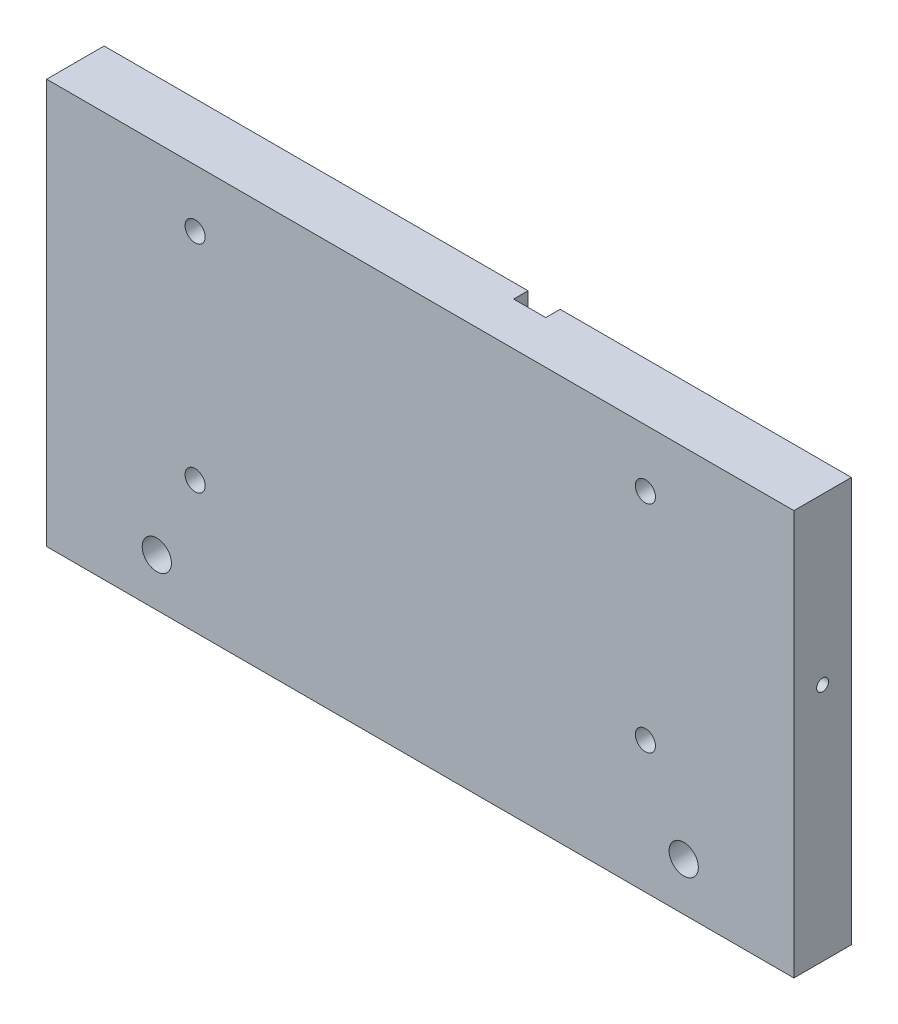
ISO-10303-21;
HEADER;
FILE_DESCRIPTION(('STEP AP214'),'2;1');
FILE_NAME('part.step','',(''),(''),'','','');
FILE_SCHEMA(('AUTOMOTIVE_DESIGN { 1 0 10303 214 1 1 1 1 }'));
ENDSEC;
DATA;
#1=APPLICATION_CONTEXT('core data for automotive mechanical design processes');
#2=APPLICATION_PROTOCOL_DEFINITION('international standard','automotive_design',2000,#1);
#3=PRODUCT_CONTEXT('',#1,'mechanical');
#4=PRODUCT('Part','Part','',(#3));
#5=PRODUCT_RELATED_PRODUCT_CATEGORY('part','',(#4));
#6=PRODUCT_DEFINITION_FORMATION('','',#4);
#7=PRODUCT_DEFINITION_CONTEXT('part definition',#1,'design');
#8=PRODUCT_DEFINITION('design','',#6,#7);
#9=PRODUCT_DEFINITION_SHAPE('','',#8);
#10=(LENGTH_UNIT() NAMED_UNIT(*) SI_UNIT(.MILLI.,.METRE.));
#11=(NAMED_UNIT(*) PLANE_ANGLE_UNIT() SI_UNIT($,.RADIAN.));
#12=(NAMED_UNIT(*) SI_UNIT($,.STERADIAN.) SOLID_ANGLE_UNIT());
#13=UNCERTAINTY_MEASURE_WITH_UNIT(LENGTH_MEASURE(1.E-05),#10,'distance_accuracy_value','');
#14=(GEOMETRIC_REPRESENTATION_CONTEXT(3) GLOBAL_UNCERTAINTY_ASSIGNED_CONTEXT((#13)) GLOBAL_UNIT_ASSIGNED_CONTEXT((#10,
#11,#12)) REPRESENTATION_CONTEXT('',''));
#15=CARTESIAN_POINT('',(0.,0.,0.));
#16=DIRECTION('',(0.,0.,1.));
#17=DIRECTION('',(1.,0.,0.));
#18=AXIS2_PLACEMENT_3D('',#15,#16,#17);
#19=CARTESIAN_POINT('',(78.,34.5,0.));
#20=DIRECTION('',(0.,1.,0.));
#21=DIRECTION('',(-1.,0.,0.));
#22=AXIS2_PLACEMENT_3D('',#19,#20,#21);
#23=PLANE('',#22);
#24=DIRECTION('',(1.,0.,0.));
#25=VECTOR('',#24,1.);
#26=CARTESIAN_POINT('',(10.5,34.5,3.));
#27=LINE('',#26,#25);
#28=CARTESIAN_POINT('',(10.5,34.5,3.));
#29=VERTEX_POINT('',#28);
#30=CARTESIAN_POINT('',(17.2,34.5,3.));
#31=VERTEX_POINT('',#30);
#32=EDGE_CURVE('E137',#29,#31,#27,.T.);
#33=ORIENTED_EDGE('',*,*,#32,.F.);
#34=DIRECTION('',(0.,0.,-1.));
#35=VECTOR('',#34,1.);
#36=CARTESIAN_POINT('',(10.5,34.5,3.));
#37=LINE('',#36,#35);
#38=CARTESIAN_POINT('',(10.5,34.5,0.));
#39=VERTEX_POINT('',#38);
#40=EDGE_CURVE('E130',#29,#39,#37,.T.);
#41=ORIENTED_EDGE('',*,*,#40,.T.);
#42=DIRECTION('',(-1.,0.,0.));
#43=VECTOR('',#42,1.);
#44=CARTESIAN_POINT('',(78.,34.5,0.));
#45=LINE('',#44,#43);
#46=CARTESIAN_POINT('',(-78.,34.5,0.));
#47=VERTEX_POINT('',#46);
#48=EDGE_CURVE('E67',#39,#47,#45,.T.);
#49=ORIENTED_EDGE('',*,*,#48,.T.);
#50=DIRECTION('',(0.,0.,1.));
#51=VECTOR('',#50,1.);
#52=CARTESIAN_POINT('',(-78.,34.5,0.));
#53=LINE('',#52,#51);
#54=CARTESIAN_POINT('',(-78.,34.5,12.));
#55=VERTEX_POINT('',#54);
#56=EDGE_CURVE('E11',#47,#55,#53,.T.);
#57=ORIENTED_EDGE('',*,*,#56,.T.);
#58=DIRECTION('',(-1.,0.,0.));
#59=VECTOR('',#58,1.);
#60=CARTESIAN_POINT('',(78.,34.5,12.));
#61=LINE('',#60,#59);
#62=CARTESIAN_POINT('',(78.,34.5,12.));
#63=VERTEX_POINT('',#62);
#64=EDGE_CURVE('E175',#63,#55,#61,.T.);
#65=ORIENTED_EDGE('',*,*,#64,.F.);
#66=DIRECTION('',(0.,0.,1.));
#67=VECTOR('',#66,1.);
#68=CARTESIAN_POINT('',(78.,34.5,0.));
#69=LINE('',#68,#67);
#70=CARTESIAN_POINT('',(78.,34.5,0.));
#71=VERTEX_POINT('',#70);
#72=EDGE_CURVE('E49',#71,#63,#69,.T.);
#73=ORIENTED_EDGE('',*,*,#72,.F.);
#74=CARTESIAN_POINT('',(17.2,34.5,0.));
#75=VERTEX_POINT('',#74);
#76=EDGE_CURVE('E180',#71,#75,#45,.T.);
#77=ORIENTED_EDGE('',*,*,#76,.T.);
#78=DIRECTION('',(0.,0.,-1.));
#79=VECTOR('',#78,1.);
#80=CARTESIAN_POINT('',(17.2,34.5,3.));
#81=LINE('',#80,#79);
#82=EDGE_CURVE('E164',#31,#75,#81,.T.);
#83=ORIENTED_EDGE('',*,*,#82,.F.);
#84=EDGE_LOOP('',(#33,#41,#49,#57,#65,#73,#77,#83));
#85=FACE_BOUND('',#84,.T.);
#86=ADVANCED_FACE('F41',(#85),#23,.T.);
#87=CARTESIAN_POINT('',(0.,0.,0.));
#88=DIRECTION('',(0.,0.,1.));
#89=DIRECTION('',(1.,0.,0.));
#90=AXIS2_PLACEMENT_3D('',#87,#88,#89);
#91=PLANE('',#90);
#92=CARTESIAN_POINT('',(55.,-40.,0.));
#93=DIRECTION('',(0.,0.,-1.));
#94=DIRECTION('',(-1.,0.,0.));
#95=AXIS2_PLACEMENT_3D('',#92,#93,#94);
#96=CIRCLE('',#95,3.04999999999998);
#97=CARTESIAN_POINT('',(51.95,-40.,0.));
#98=VERTEX_POINT('',#97);
#99=EDGE_CURVE('E272',#98,#98,#96,.T.);
#100=ORIENTED_EDGE('',*,*,#99,.F.);
#101=EDGE_LOOP('',(#100));
#102=FACE_BOUND('',#101,.T.);
#103=CARTESIAN_POINT('',(-55.,-40.,0.));
#104=DIRECTION('',(0.,0.,-1.));
#105=DIRECTION('',(-1.,0.,0.));
#106=AXIS2_PLACEMENT_3D('',#103,#104,#105);
#107=CIRCLE('',#106,3.04999999999998);
#108=CARTESIAN_POINT('',(-58.05,-40.,0.));
#109=VERTEX_POINT('',#108);
#110=EDGE_CURVE('E261',#109,#109,#107,.T.);
#111=ORIENTED_EDGE('',*,*,#110,.F.);
#112=EDGE_LOOP('',(#111));
#113=FACE_BOUND('',#112,.T.);
#114=DIRECTION('',(0.,-1.,0.));
#115=VECTOR('',#114,1.);
#116=CARTESIAN_POINT('',(17.2,34.5,0.));
#117=LINE('',#116,#115);
#118=CARTESIAN_POINT('',(17.2,20.,0.));
#119=VERTEX_POINT('',#118);
#120=EDGE_CURVE('E59',#75,#119,#117,.T.);
#121=ORIENTED_EDGE('',*,*,#120,.F.);
#122=ORIENTED_EDGE('',*,*,#76,.F.);
#123=DIRECTION('',(0.,1.,0.));
#124=VECTOR('',#123,1.);
#125=CARTESIAN_POINT('',(78.,-50.,0.));
#126=LINE('',#125,#124);
#127=CARTESIAN_POINT('',(78.,-50.,0.));
#128=VERTEX_POINT('',#127);
#129=EDGE_CURVE('E172',#128,#71,#126,.T.);
#130=ORIENTED_EDGE('',*,*,#129,.F.);
#131=DIRECTION('',(1.,0.,0.));
#132=VECTOR('',#131,1.);
#133=CARTESIAN_POINT('',(-78.,-50.,0.));
#134=LINE('',#133,#132);
#135=CARTESIAN_POINT('',(-78.,-50.,0.));
#136=VERTEX_POINT('',#135);
#137=EDGE_CURVE('E171',#136,#128,#134,.T.);
#138=ORIENTED_EDGE('',*,*,#137,.F.);
#139=DIRECTION('',(0.,-1.,0.));
#140=VECTOR('',#139,1.);
#141=CARTESIAN_POINT('',(-78.,34.5,0.));
#142=LINE('',#141,#140);
#143=EDGE_CURVE('E166',#47,#136,#142,.T.);
#144=ORIENTED_EDGE('',*,*,#143,.F.);
#145=ORIENTED_EDGE('',*,*,#48,.F.);
#146=DIRECTION('',(0.,1.,0.));
#147=VECTOR('',#146,1.);
#148=CARTESIAN_POINT('',(10.5,24.003958006962,0.));
#149=LINE('',#148,#147);
#150=CARTESIAN_POINT('',(10.5,24.003958006962,0.));
#151=VERTEX_POINT('',#150);
#152=EDGE_CURVE('E160',#151,#39,#149,.T.);
#153=ORIENTED_EDGE('',*,*,#152,.F.);
#154=CARTESIAN_POINT('',(0.,0.,0.));
#155=DIRECTION('',(0.,0.,-1.));
#156=DIRECTION('',(-1.,0.,0.));
#157=AXIS2_PLACEMENT_3D('',#154,#155,#156);
#158=CIRCLE('',#157,26.1999999999999);
#159=CARTESIAN_POINT('',(16.924538398432,20.,0.));
#160=VERTEX_POINT('',#159);
#161=EDGE_CURVE('E127',#160,#151,#158,.T.);
#162=ORIENTED_EDGE('',*,*,#161,.F.);
#163=DIRECTION('',(-1.,0.,0.));
#164=VECTOR('',#163,1.);
#165=CARTESIAN_POINT('',(17.2,20.,0.));
#166=LINE('',#165,#164);
#167=EDGE_CURVE('E144',#119,#160,#166,.T.);
#168=ORIENTED_EDGE('',*,*,#167,.F.);
#169=EDGE_LOOP('',(#121,#122,#130,#138,#144,#145,#153,#162,#168));
#170=FACE_BOUND('',#169,.T.);
#171=ADVANCED_FACE('F203',(#102,#113,#170),#91,.F.);
#172=CARTESIAN_POINT('',(-78.,34.5,0.));
#173=DIRECTION('',(-1.,0.,0.));
#174=DIRECTION('',(0.,0.,1.));
#175=AXIS2_PLACEMENT_3D('',#172,#173,#174);
#176=PLANE('',#175);
#177=DIRECTION('',(0.,-1.,0.));
#178=VECTOR('',#177,1.);
#179=CARTESIAN_POINT('',(-78.,34.5,12.));
#180=LINE('',#179,#178);
#181=CARTESIAN_POINT('',(-78.,-50.,12.));
#182=VERTEX_POINT('',#181);
#183=EDGE_CURVE('E162',#55,#182,#180,.T.);
#184=ORIENTED_EDGE('',*,*,#183,.F.);
#185=ORIENTED_EDGE('',*,*,#56,.F.);
#186=ORIENTED_EDGE('',*,*,#143,.T.);
#187=DIRECTION('',(0.,0.,1.));
#188=VECTOR('',#187,1.);
#189=CARTESIAN_POINT('',(-78.,-50.,0.));
#190=LINE('',#189,#188);
#191=EDGE_CURVE('E44',#136,#182,#190,.T.);
#192=ORIENTED_EDGE('',*,*,#191,.T.);
#193=EDGE_LOOP('',(#184,#185,#186,#192));
#194=FACE_BOUND('',#193,.T.);
#195=ADVANCED_FACE('F43',(#194),#176,.T.);
#196=CARTESIAN_POINT('',(78.,-50.,0.));
#197=DIRECTION('',(1.,0.,0.));
#198=DIRECTION('',(0.,0.,-1.));
#199=AXIS2_PLACEMENT_3D('',#196,#197,#198);
#200=PLANE('',#199);
#201=CARTESIAN_POINT('',(78.,0.,6.));
#202=DIRECTION('',(1.,0.,0.));
#203=DIRECTION('',(0.,0.,-1.));
#204=AXIS2_PLACEMENT_3D('',#201,#202,#203);
#205=CIRCLE('',#204,1.24999999999999);
#206=CARTESIAN_POINT('',(78.,0.,4.75000000000001));
#207=VERTEX_POINT('',#206);
#208=EDGE_CURVE('E265',#207,#207,#205,.T.);
#209=ORIENTED_EDGE('',*,*,#208,.F.);
#210=EDGE_LOOP('',(#209));
#211=FACE_BOUND('',#210,.T.);
#212=DIRECTION('',(0.,1.,0.));
#213=VECTOR('',#212,1.);
#214=CARTESIAN_POINT('',(78.,-50.,12.));
#215=LINE('',#214,#213);
#216=CARTESIAN_POINT('',(78.,-50.,12.));
#217=VERTEX_POINT('',#216);
#218=EDGE_CURVE('E184',#217,#63,#215,.T.);
#219=ORIENTED_EDGE('',*,*,#218,.F.);
#220=DIRECTION('',(0.,0.,1.));
#221=VECTOR('',#220,1.);
#222=CARTESIAN_POINT('',(78.,-50.,0.));
#223=LINE('',#222,#221);
#224=EDGE_CURVE('E188',#128,#217,#223,.T.);
#225=ORIENTED_EDGE('',*,*,#224,.F.);
#226=ORIENTED_EDGE('',*,*,#129,.T.);
#227=ORIENTED_EDGE('',*,*,#72,.T.);
#228=EDGE_LOOP('',(#219,#225,#226,#227));
#229=FACE_BOUND('',#228,.T.);
#230=ADVANCED_FACE('F201',(#211,#229),#200,.T.);
#231=CARTESIAN_POINT('',(-78.,-50.,0.));
#232=DIRECTION('',(0.,-1.,0.));
#233=DIRECTION('',(0.,0.,-1.));
#234=AXIS2_PLACEMENT_3D('',#231,#232,#233);
#235=PLANE('',#234);
#236=DIRECTION('',(1.,0.,0.));
#237=VECTOR('',#236,1.);
#238=CARTESIAN_POINT('',(-78.,-50.,12.));
#239=LINE('',#238,#237);
#240=EDGE_CURVE('E185',#182,#217,#239,.T.);
#241=ORIENTED_EDGE('',*,*,#240,.F.);
#242=ORIENTED_EDGE('',*,*,#191,.F.);
#243=ORIENTED_EDGE('',*,*,#137,.T.);
#244=ORIENTED_EDGE('',*,*,#224,.T.);
#245=EDGE_LOOP('',(#241,#242,#243,#244));
#246=FACE_BOUND('',#245,.T.);
#247=ADVANCED_FACE('F193',(#246),#235,.T.);
#248=CARTESIAN_POINT('',(0.,0.,12.));
#249=DIRECTION('',(0.,0.,1.));
#250=DIRECTION('',(1.,0.,0.));
#251=AXIS2_PLACEMENT_3D('',#248,#249,#250);
#252=PLANE('',#251);
#253=CARTESIAN_POINT('',(47.,22.5,12.));
#254=DIRECTION('',(0.,0.,1.));
#255=DIRECTION('',(1.,0.,0.));
#256=AXIS2_PLACEMENT_3D('',#253,#254,#255);
#257=CIRCLE('',#256,2.09999999999999);
#258=CARTESIAN_POINT('',(49.1,22.5,12.));
#259=VERTEX_POINT('',#258);
#260=EDGE_CURVE('E245',#259,#259,#257,.T.);
#261=ORIENTED_EDGE('',*,*,#260,.F.);
#262=EDGE_LOOP('',(#261));
#263=FACE_BOUND('',#262,.T.);
#264=CARTESIAN_POINT('',(-47.,22.5,12.));
#265=DIRECTION('',(0.,0.,1.));
#266=DIRECTION('',(1.,0.,0.));
#267=AXIS2_PLACEMENT_3D('',#264,#265,#266);
#268=CIRCLE('',#267,2.09999999999999);
#269=CARTESIAN_POINT('',(-44.9,22.5,12.));
#270=VERTEX_POINT('',#269);
#271=EDGE_CURVE('E246',#270,#270,#268,.T.);
#272=ORIENTED_EDGE('',*,*,#271,.F.);
#273=EDGE_LOOP('',(#272));
#274=FACE_BOUND('',#273,.T.);
#275=CARTESIAN_POINT('',(47.,-22.5,12.));
#276=DIRECTION('',(0.,0.,1.));
#277=DIRECTION('',(1.,0.,0.));
#278=AXIS2_PLACEMENT_3D('',#275,#276,#277);
#279=CIRCLE('',#278,2.09999999999999);
#280=CARTESIAN_POINT('',(49.1,-22.5,12.));
#281=VERTEX_POINT('',#280);
#282=EDGE_CURVE('E249',#281,#281,#279,.T.);
#283=ORIENTED_EDGE('',*,*,#282,.F.);
#284=EDGE_LOOP('',(#283));
#285=FACE_BOUND('',#284,.T.);
#286=CARTESIAN_POINT('',(-47.,-22.5,12.));
#287=DIRECTION('',(0.,0.,1.));
#288=DIRECTION('',(1.,0.,0.));
#289=AXIS2_PLACEMENT_3D('',#286,#287,#288);
#290=CIRCLE('',#289,2.09999999999999);
#291=CARTESIAN_POINT('',(-44.9,-22.5,12.));
#292=VERTEX_POINT('',#291);
#293=EDGE_CURVE('E251',#292,#292,#290,.T.);
#294=ORIENTED_EDGE('',*,*,#293,.F.);
#295=EDGE_LOOP('',(#294));
#296=FACE_BOUND('',#295,.T.);
#297=CARTESIAN_POINT('',(55.,-40.,12.));
#298=DIRECTION('',(0.,0.,-1.));
#299=DIRECTION('',(-1.,0.,0.));
#300=AXIS2_PLACEMENT_3D('',#297,#298,#299);
#301=CIRCLE('',#300,3.04999999999998);
#302=CARTESIAN_POINT('',(51.95,-40.,12.));
#303=VERTEX_POINT('',#302);
#304=EDGE_CURVE('E259',#303,#303,#301,.T.);
#305=ORIENTED_EDGE('',*,*,#304,.T.);
#306=EDGE_LOOP('',(#305));
#307=FACE_BOUND('',#306,.T.);
#308=CARTESIAN_POINT('',(-55.,-40.,12.));
#309=DIRECTION('',(0.,0.,-1.));
#310=DIRECTION('',(-1.,0.,0.));
#311=AXIS2_PLACEMENT_3D('',#308,#309,#310);
#312=CIRCLE('',#311,3.04999999999998);
#313=CARTESIAN_POINT('',(-58.05,-40.,12.));
#314=VERTEX_POINT('',#313);
#315=EDGE_CURVE('E262',#314,#314,#312,.T.);
#316=ORIENTED_EDGE('',*,*,#315,.T.);
#317=EDGE_LOOP('',(#316));
#318=FACE_BOUND('',#317,.T.);
#319=ORIENTED_EDGE('',*,*,#183,.T.);
#320=ORIENTED_EDGE('',*,*,#240,.T.);
#321=ORIENTED_EDGE('',*,*,#218,.T.);
#322=ORIENTED_EDGE('',*,*,#64,.T.);
#323=EDGE_LOOP('',(#319,#320,#321,#322));
#324=FACE_BOUND('',#323,.T.);
#325=ADVANCED_FACE('F197',(#263,#274,#285,#296,#307,#318,#324),#252,.T.);
#326=CARTESIAN_POINT('',(0.,0.,3.));
#327=DIRECTION('',(0.,0.,-1.));
#328=DIRECTION('',(-1.,0.,0.));
#329=AXIS2_PLACEMENT_3D('',#326,#327,#328);
#330=CYLINDRICAL_SURFACE('',#329,26.1999999999999);
#331=ORIENTED_EDGE('',*,*,#161,.T.);
#332=DIRECTION('',(0.,0.,-1.));
#333=VECTOR('',#332,1.);
#334=CARTESIAN_POINT('',(10.5,24.003958006962,3.));
#335=LINE('',#334,#333);
#336=CARTESIAN_POINT('',(10.5,24.003958006962,3.));
#337=VERTEX_POINT('',#336);
#338=EDGE_CURVE('E119',#337,#151,#335,.T.);
#339=ORIENTED_EDGE('',*,*,#338,.F.);
#340=CARTESIAN_POINT('',(0.,0.,3.));
#341=DIRECTION('',(0.,0.,-1.));
#342=DIRECTION('',(-1.,0.,0.));
#343=AXIS2_PLACEMENT_3D('',#340,#341,#342);
#344=CIRCLE('',#343,26.1999999999999);
#345=CARTESIAN_POINT('',(16.924538398432,20.,3.));
#346=VERTEX_POINT('',#345);
#347=EDGE_CURVE('E121',#346,#337,#344,.T.);
#348=ORIENTED_EDGE('',*,*,#347,.F.);
#349=DIRECTION('',(0.,0.,-1.));
#350=VECTOR('',#349,1.);
#351=CARTESIAN_POINT('',(16.924538398432,20.,3.));
#352=LINE('',#351,#350);
#353=EDGE_CURVE('E159',#346,#160,#352,.T.);
#354=ORIENTED_EDGE('',*,*,#353,.T.);
#355=EDGE_LOOP('',(#331,#339,#348,#354));
#356=FACE_BOUND('',#355,.T.);
#357=ADVANCED_FACE('F125',(#356),#330,.F.);
#358=CARTESIAN_POINT('',(17.2,20.,3.));
#359=DIRECTION('',(0.,-1.,0.));
#360=DIRECTION('',(0.,0.,-1.));
#361=AXIS2_PLACEMENT_3D('',#358,#359,#360);
#362=PLANE('',#361);
#363=ORIENTED_EDGE('',*,*,#167,.T.);
#364=ORIENTED_EDGE('',*,*,#353,.F.);
#365=DIRECTION('',(-1.,0.,0.));
#366=VECTOR('',#365,1.);
#367=CARTESIAN_POINT('',(17.2,20.,3.));
#368=LINE('',#367,#366);
#369=CARTESIAN_POINT('',(17.2,20.,3.));
#370=VERTEX_POINT('',#369);
#371=EDGE_CURVE('E132',#370,#346,#368,.T.);
#372=ORIENTED_EDGE('',*,*,#371,.F.);
#373=DIRECTION('',(0.,0.,-1.));
#374=VECTOR('',#373,1.);
#375=CARTESIAN_POINT('',(17.2,20.,3.));
#376=LINE('',#375,#374);
#377=EDGE_CURVE('E161',#370,#119,#376,.T.);
#378=ORIENTED_EDGE('',*,*,#377,.T.);
#379=EDGE_LOOP('',(#363,#364,#372,#378));
#380=FACE_BOUND('',#379,.T.);
#381=ADVANCED_FACE('F207',(#380),#362,.F.);
#382=CARTESIAN_POINT('',(17.2,34.5,3.));
#383=DIRECTION('',(1.,0.,0.));
#384=DIRECTION('',(0.,0.,-1.));
#385=AXIS2_PLACEMENT_3D('',#382,#383,#384);
#386=PLANE('',#385);
#387=ORIENTED_EDGE('',*,*,#120,.T.);
#388=ORIENTED_EDGE('',*,*,#377,.F.);
#389=DIRECTION('',(0.,-1.,0.));
#390=VECTOR('',#389,1.);
#391=CARTESIAN_POINT('',(17.2,34.5,3.));
#392=LINE('',#391,#390);
#393=EDGE_CURVE('E155',#31,#370,#392,.T.);
#394=ORIENTED_EDGE('',*,*,#393,.F.);
#395=ORIENTED_EDGE('',*,*,#82,.T.);
#396=EDGE_LOOP('',(#387,#388,#394,#395));
#397=FACE_BOUND('',#396,.T.);
#398=ADVANCED_FACE('F210',(#397),#386,.F.);
#399=CARTESIAN_POINT('',(10.5,24.003958006962,3.));
#400=DIRECTION('',(-1.,0.,0.));
#401=DIRECTION('',(0.,0.,1.));
#402=AXIS2_PLACEMENT_3D('',#399,#400,#401);
#403=PLANE('',#402);
#404=ORIENTED_EDGE('',*,*,#152,.T.);
#405=ORIENTED_EDGE('',*,*,#40,.F.);
#406=DIRECTION('',(0.,1.,0.));
#407=VECTOR('',#406,1.);
#408=CARTESIAN_POINT('',(10.5,24.003958006962,3.));
#409=LINE('',#408,#407);
#410=EDGE_CURVE('E131',#337,#29,#409,.T.);
#411=ORIENTED_EDGE('',*,*,#410,.F.);
#412=ORIENTED_EDGE('',*,*,#338,.T.);
#413=EDGE_LOOP('',(#404,#405,#411,#412));
#414=FACE_BOUND('',#413,.T.);
#415=ADVANCED_FACE('F133',(#414),#403,.F.);
#416=CARTESIAN_POINT('',(0.,0.,3.));
#417=DIRECTION('',(0.,0.,-1.));
#418=DIRECTION('',(-1.,0.,0.));
#419=AXIS2_PLACEMENT_3D('',#416,#417,#418);
#420=PLANE('',#419);
#421=ORIENTED_EDGE('',*,*,#347,.T.);
#422=ORIENTED_EDGE('',*,*,#410,.T.);
#423=ORIENTED_EDGE('',*,*,#32,.T.);
#424=ORIENTED_EDGE('',*,*,#393,.T.);
#425=ORIENTED_EDGE('',*,*,#371,.T.);
#426=EDGE_LOOP('',(#421,#422,#423,#424,#425));
#427=FACE_BOUND('',#426,.T.);
#428=ADVANCED_FACE('F142',(#427),#420,.T.);
#429=CARTESIAN_POINT('',(68.,0.,6.));
#430=DIRECTION('',(-1.,0.,0.));
#431=DIRECTION('',(0.,0.,1.));
#432=AXIS2_PLACEMENT_3D('',#429,#430,#431);
#433=PLANE('',#432);
#434=CARTESIAN_POINT('',(68.,0.,6.));
#435=DIRECTION('',(1.,0.,0.));
#436=DIRECTION('',(0.,0.,-1.));
#437=AXIS2_PLACEMENT_3D('',#434,#435,#436);
#438=CIRCLE('',#437,1.24999999999999);
#439=CARTESIAN_POINT('',(68.,0.,4.75000000000001));
#440=VERTEX_POINT('',#439);
#441=EDGE_CURVE('E148',#440,#440,#438,.T.);
#442=ORIENTED_EDGE('',*,*,#441,.T.);
#443=EDGE_LOOP('',(#442));
#444=FACE_BOUND('',#443,.T.);
#445=ADVANCED_FACE('F332',(#444),#433,.F.);
#446=CARTESIAN_POINT('',(78.,0.,6.));
#447=DIRECTION('',(1.,0.,0.));
#448=DIRECTION('',(0.,0.,-1.));
#449=AXIS2_PLACEMENT_3D('',#446,#447,#448);
#450=CYLINDRICAL_SURFACE('',#449,1.24999999999999);
#451=ORIENTED_EDGE('',*,*,#441,.F.);
#452=EDGE_LOOP('',(#451));
#453=FACE_BOUND('',#452,.T.);
#454=ORIENTED_EDGE('',*,*,#208,.T.);
#455=EDGE_LOOP('',(#454));
#456=FACE_BOUND('',#455,.T.);
#457=ADVANCED_FACE('F331',(#453,#456),#450,.F.);
#458=CARTESIAN_POINT('',(-55.,-40.,0.));
#459=DIRECTION('',(0.,0.,-1.));
#460=DIRECTION('',(-1.,0.,0.));
#461=AXIS2_PLACEMENT_3D('',#458,#459,#460);
#462=CYLINDRICAL_SURFACE('',#461,3.04999999999998);
#463=ORIENTED_EDGE('',*,*,#315,.F.);
#464=EDGE_LOOP('',(#463));
#465=FACE_BOUND('',#464,.T.);
#466=ORIENTED_EDGE('',*,*,#110,.T.);
#467=EDGE_LOOP('',(#466));
#468=FACE_BOUND('',#467,.T.);
#469=ADVANCED_FACE('F329',(#465,#468),#462,.F.);
#470=CARTESIAN_POINT('',(55.,-40.,0.));
#471=DIRECTION('',(0.,0.,-1.));
#472=DIRECTION('',(-1.,0.,0.));
#473=AXIS2_PLACEMENT_3D('',#470,#471,#472);
#474=CYLINDRICAL_SURFACE('',#473,3.04999999999998);
#475=ORIENTED_EDGE('',*,*,#304,.F.);
#476=EDGE_LOOP('',(#475));
#477=FACE_BOUND('',#476,.T.);
#478=ORIENTED_EDGE('',*,*,#99,.T.);
#479=EDGE_LOOP('',(#478));
#480=FACE_BOUND('',#479,.T.);
#481=ADVANCED_FACE('F323',(#477,#480),#474,.F.);
#482=CARTESIAN_POINT('',(-47.,-22.5,4.00000000000001));
#483=DIRECTION('',(0.,0.,-1.));
#484=DIRECTION('',(-1.,0.,0.));
#485=AXIS2_PLACEMENT_3D('',#482,#483,#484);
#486=PLANE('',#485);
#487=CARTESIAN_POINT('',(-47.,-22.5,4.00000000000001));
#488=DIRECTION('',(0.,0.,1.));
#489=DIRECTION('',(1.,0.,0.));
#490=AXIS2_PLACEMENT_3D('',#487,#488,#489);
#491=CIRCLE('',#490,2.09999999999998);
#492=CARTESIAN_POINT('',(-44.9,-22.5,4.00000000000001));
#493=VERTEX_POINT('',#492);
#494=EDGE_CURVE('E274',#493,#493,#491,.T.);
#495=ORIENTED_EDGE('',*,*,#494,.T.);
#496=EDGE_LOOP('',(#495));
#497=FACE_BOUND('',#496,.T.);
#498=ADVANCED_FACE('F321',(#497),#486,.F.);
#499=CARTESIAN_POINT('',(-47.,-22.5,12.));
#500=DIRECTION('',(0.,0.,1.));
#501=DIRECTION('',(1.,0.,0.));
#502=AXIS2_PLACEMENT_3D('',#499,#500,#501);
#503=CYLINDRICAL_SURFACE('',#502,2.09999999999999);
#504=ORIENTED_EDGE('',*,*,#494,.F.);
#505=EDGE_LOOP('',(#504));
#506=FACE_BOUND('',#505,.T.);
#507=ORIENTED_EDGE('',*,*,#293,.T.);
#508=EDGE_LOOP('',(#507));
#509=FACE_BOUND('',#508,.T.);
#510=ADVANCED_FACE('F320',(#506,#509),#503,.F.);
#511=CARTESIAN_POINT('',(47.,-22.5,4.00000000000001));
#512=DIRECTION('',(0.,0.,-1.));
#513=DIRECTION('',(-1.,0.,0.));
#514=AXIS2_PLACEMENT_3D('',#511,#512,#513);
#515=PLANE('',#514);
#516=CARTESIAN_POINT('',(47.,-22.5,4.00000000000001));
#517=DIRECTION('',(0.,0.,1.));
#518=DIRECTION('',(1.,0.,0.));
#519=AXIS2_PLACEMENT_3D('',#516,#517,#518);
#520=CIRCLE('',#519,2.09999999999998);
#521=CARTESIAN_POINT('',(49.1,-22.5,4.00000000000001));
#522=VERTEX_POINT('',#521);
#523=EDGE_CURVE('E279',#522,#522,#520,.T.);
#524=ORIENTED_EDGE('',*,*,#523,.T.);
#525=EDGE_LOOP('',(#524));
#526=FACE_BOUND('',#525,.T.);
#527=ADVANCED_FACE('F312',(#526),#515,.F.);
#528=CARTESIAN_POINT('',(47.,-22.5,12.));
#529=DIRECTION('',(0.,0.,1.));
#530=DIRECTION('',(1.,0.,0.));
#531=AXIS2_PLACEMENT_3D('',#528,#529,#530);
#532=CYLINDRICAL_SURFACE('',#531,2.09999999999999);
#533=ORIENTED_EDGE('',*,*,#523,.F.);
#534=EDGE_LOOP('',(#533));
#535=FACE_BOUND('',#534,.T.);
#536=ORIENTED_EDGE('',*,*,#282,.T.);
#537=EDGE_LOOP('',(#536));
#538=FACE_BOUND('',#537,.T.);
#539=ADVANCED_FACE('F307',(#535,#538),#532,.F.);
#540=CARTESIAN_POINT('',(-47.,22.5,4.00000000000001));
#541=DIRECTION('',(0.,0.,-1.));
#542=DIRECTION('',(-1.,0.,0.));
#543=AXIS2_PLACEMENT_3D('',#540,#541,#542);
#544=PLANE('',#543);
#545=CARTESIAN_POINT('',(-47.,22.5,4.00000000000001));
#546=DIRECTION('',(0.,0.,1.));
#547=DIRECTION('',(1.,0.,0.));
#548=AXIS2_PLACEMENT_3D('',#545,#546,#547);
#549=CIRCLE('',#548,2.09999999999998);
#550=CARTESIAN_POINT('',(-44.9,22.5,4.00000000000001));
#551=VERTEX_POINT('',#550);
#552=EDGE_CURVE('E284',#551,#551,#549,.T.);
#553=ORIENTED_EDGE('',*,*,#552,.T.);
#554=EDGE_LOOP('',(#553));
#555=FACE_BOUND('',#554,.T.);
#556=ADVANCED_FACE('F304',(#555),#544,.F.);
#557=CARTESIAN_POINT('',(-47.,22.5,12.));
#558=DIRECTION('',(0.,0.,1.));
#559=DIRECTION('',(1.,0.,0.));
#560=AXIS2_PLACEMENT_3D('',#557,#558,#559);
#561=CYLINDRICAL_SURFACE('',#560,2.09999999999999);
#562=ORIENTED_EDGE('',*,*,#552,.F.);
#563=EDGE_LOOP('',(#562));
#564=FACE_BOUND('',#563,.T.);
#565=ORIENTED_EDGE('',*,*,#271,.T.);
#566=EDGE_LOOP('',(#565));
#567=FACE_BOUND('',#566,.T.);
#568=ADVANCED_FACE('F296',(#564,#567),#561,.F.);
#569=CARTESIAN_POINT('',(47.,22.5,4.00000000000001));
#570=DIRECTION('',(0.,0.,-1.));
#571=DIRECTION('',(-1.,0.,0.));
#572=AXIS2_PLACEMENT_3D('',#569,#570,#571);
#573=PLANE('',#572);
#574=CARTESIAN_POINT('',(47.,22.5,4.00000000000001));
#575=DIRECTION('',(0.,0.,1.));
#576=DIRECTION('',(1.,0.,0.));
#577=AXIS2_PLACEMENT_3D('',#574,#575,#576);
#578=CIRCLE('',#577,2.09999999999998);
#579=CARTESIAN_POINT('',(49.1,22.5,4.00000000000001));
#580=VERTEX_POINT('',#579);
#581=EDGE_CURVE('E286',#580,#580,#578,.T.);
#582=ORIENTED_EDGE('',*,*,#581,.T.);
#583=EDGE_LOOP('',(#582));
#584=FACE_BOUND('',#583,.T.);
#585=ADVANCED_FACE('F292',(#584),#573,.F.);
#586=CARTESIAN_POINT('',(47.,22.5,12.));
#587=DIRECTION('',(0.,0.,1.));
#588=DIRECTION('',(1.,0.,0.));
#589=AXIS2_PLACEMENT_3D('',#586,#587,#588);
#590=CYLINDRICAL_SURFACE('',#589,2.09999999999999);
#591=ORIENTED_EDGE('',*,*,#581,.F.);
#592=EDGE_LOOP('',(#591));
#593=FACE_BOUND('',#592,.T.);
#594=ORIENTED_EDGE('',*,*,#260,.T.);
#595=EDGE_LOOP('',(#594));
#596=FACE_BOUND('',#595,.T.);
#597=ADVANCED_FACE('F289',(#593,#596),#590,.F.);
#598=CLOSED_SHELL('',(#86,#171,#195,#230,#247,#325,#357,#381,#398,#415,#428,#445,#457,#469,#481,
#498,#510,#527,#539,#556,#568,#585,#597));
#599=MANIFOLD_SOLID_BREP('B2',#598);
#600=ADVANCED_BREP_SHAPE_REPRESENTATION('',(#18,#599),#14);
#601=SHAPE_DEFINITION_REPRESENTATION(#9,#600);
ENDSEC;
END-ISO-10303-21;
